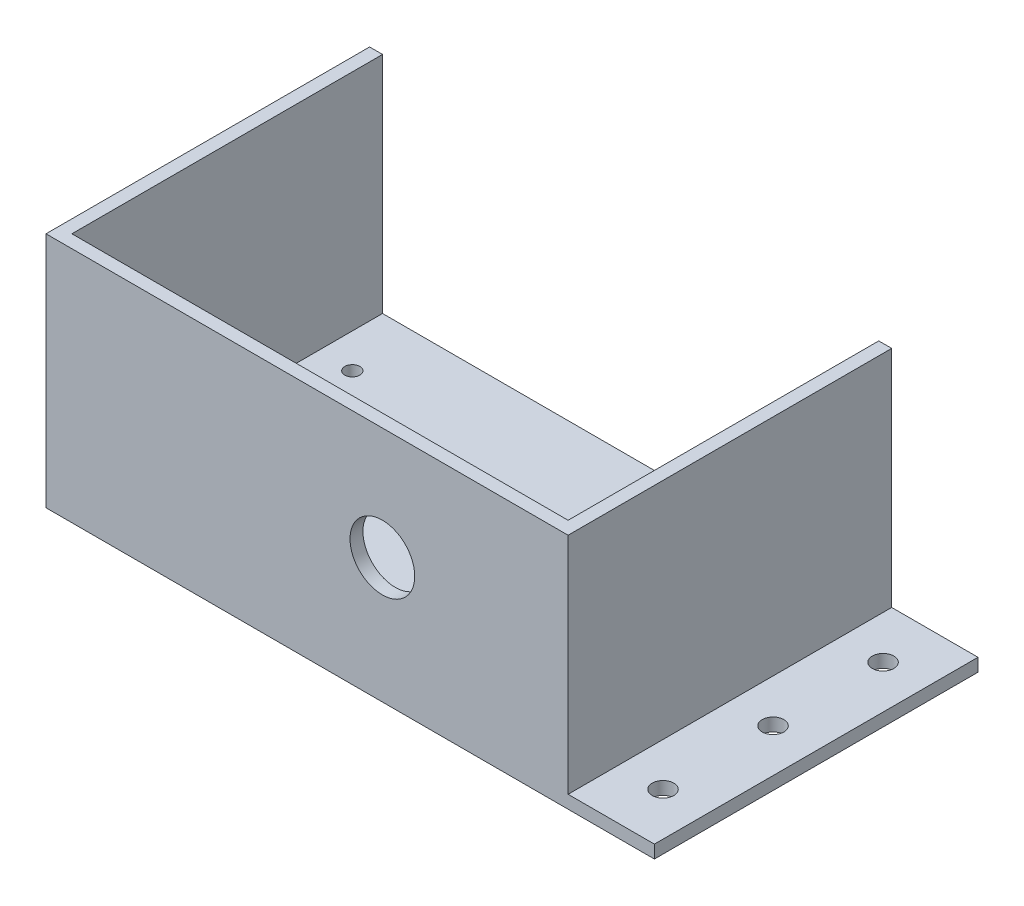
ISO-10303-21;
HEADER;
FILE_DESCRIPTION(('STEP AP214'),'2;1');
FILE_NAME('part.step','',(''),(''),'','','');
FILE_SCHEMA(('AUTOMOTIVE_DESIGN { 1 0 10303 214 1 1 1 1 }'));
ENDSEC;
DATA;
#1=APPLICATION_CONTEXT('core data for automotive mechanical design processes');
#2=APPLICATION_PROTOCOL_DEFINITION('international standard','automotive_design',2000,#1);
#3=PRODUCT_CONTEXT('',#1,'mechanical');
#4=PRODUCT('Part','Part','',(#3));
#5=PRODUCT_RELATED_PRODUCT_CATEGORY('part','',(#4));
#6=PRODUCT_DEFINITION_FORMATION('','',#4);
#7=PRODUCT_DEFINITION_CONTEXT('part definition',#1,'design');
#8=PRODUCT_DEFINITION('design','',#6,#7);
#9=PRODUCT_DEFINITION_SHAPE('','',#8);
#10=(LENGTH_UNIT() NAMED_UNIT(*) SI_UNIT(.MILLI.,.METRE.));
#11=(NAMED_UNIT(*) PLANE_ANGLE_UNIT() SI_UNIT($,.RADIAN.));
#12=(NAMED_UNIT(*) SI_UNIT($,.STERADIAN.) SOLID_ANGLE_UNIT());
#13=UNCERTAINTY_MEASURE_WITH_UNIT(LENGTH_MEASURE(1.E-05),#10,'distance_accuracy_value','');
#14=(GEOMETRIC_REPRESENTATION_CONTEXT(3) GLOBAL_UNCERTAINTY_ASSIGNED_CONTEXT((#13)) GLOBAL_UNIT_ASSIGNED_CONTEXT((#10,
#11,#12)) REPRESENTATION_CONTEXT('',''));
#15=CARTESIAN_POINT('',(0.,0.,0.));
#16=DIRECTION('',(0.,0.,1.));
#17=DIRECTION('',(1.,0.,0.));
#18=AXIS2_PLACEMENT_3D('',#15,#16,#17);
#19=CARTESIAN_POINT('',(121.,58.,0.));
#20=DIRECTION('',(-1.,0.,0.));
#21=DIRECTION('',(0.,0.,1.));
#22=AXIS2_PLACEMENT_3D('',#19,#20,#21);
#23=PLANE('',#22);
#24=DIRECTION('',(0.,-1.,0.));
#25=VECTOR('',#24,1.);
#26=CARTESIAN_POINT('',(121.,58.,-75.));
#27=LINE('',#26,#25);
#28=CARTESIAN_POINT('',(121.,55.,-75.));
#29=VERTEX_POINT('',#28);
#30=CARTESIAN_POINT('',(121.,3.00000000000002,-75.));
#31=VERTEX_POINT('',#30);
#32=EDGE_CURVE('E57',#29,#31,#27,.T.);
#33=ORIENTED_EDGE('',*,*,#32,.F.);
#34=DIRECTION('',(0.,0.,1.));
#35=VECTOR('',#34,1.);
#36=CARTESIAN_POINT('',(121.,55.,-75.));
#37=LINE('',#36,#35);
#38=CARTESIAN_POINT('',(121.,55.,0.));
#39=VERTEX_POINT('',#38);
#40=EDGE_CURVE('E128',#29,#39,#37,.T.);
#41=ORIENTED_EDGE('',*,*,#40,.T.);
#42=DIRECTION('',(0.,-1.,0.));
#43=VECTOR('',#42,1.);
#44=CARTESIAN_POINT('',(121.,58.,0.));
#45=LINE('',#44,#43);
#46=CARTESIAN_POINT('',(121.,3.,0.));
#47=VERTEX_POINT('',#46);
#48=EDGE_CURVE('E135',#39,#47,#45,.T.);
#49=ORIENTED_EDGE('',*,*,#48,.T.);
#50=DIRECTION('',(0.,0.,1.));
#51=VECTOR('',#50,1.);
#52=CARTESIAN_POINT('',(121.,3.,0.));
#53=LINE('',#52,#51);
#54=EDGE_CURVE('E180',#31,#47,#53,.T.);
#55=ORIENTED_EDGE('',*,*,#54,.F.);
#56=EDGE_LOOP('',(#33,#41,#49,#55));
#57=FACE_BOUND('',#56,.T.);
#58=ADVANCED_FACE('F35',(#57),#23,.F.);
#59=CARTESIAN_POINT('',(0.,58.,0.));
#60=DIRECTION('',(1.,0.,0.));
#61=DIRECTION('',(0.,0.,-1.));
#62=AXIS2_PLACEMENT_3D('',#59,#60,#61);
#63=PLANE('',#62);
#64=DIRECTION('',(0.,-1.,0.));
#65=VECTOR('',#64,1.);
#66=CARTESIAN_POINT('',(0.,58.,0.));
#67=LINE('',#66,#65);
#68=CARTESIAN_POINT('',(0.,55.,0.));
#69=VERTEX_POINT('',#68);
#70=CARTESIAN_POINT('',(0.,0.,0.));
#71=VERTEX_POINT('',#70);
#72=EDGE_CURVE('E43',#69,#71,#67,.T.);
#73=ORIENTED_EDGE('',*,*,#72,.F.);
#74=DIRECTION('',(0.,0.,1.));
#75=VECTOR('',#74,1.);
#76=CARTESIAN_POINT('',(0.,55.,-75.));
#77=LINE('',#76,#75);
#78=CARTESIAN_POINT('',(0.,55.,-75.));
#79=VERTEX_POINT('',#78);
#80=EDGE_CURVE('E114',#79,#69,#77,.T.);
#81=ORIENTED_EDGE('',*,*,#80,.F.);
#82=DIRECTION('',(0.,-1.,0.));
#83=VECTOR('',#82,1.);
#84=CARTESIAN_POINT('',(0.,58.,-75.));
#85=LINE('',#84,#83);
#86=CARTESIAN_POINT('',(0.,0.,-75.));
#87=VERTEX_POINT('',#86);
#88=EDGE_CURVE('E126',#79,#87,#85,.T.);
#89=ORIENTED_EDGE('',*,*,#88,.T.);
#90=DIRECTION('',(0.,0.,1.));
#91=VECTOR('',#90,1.);
#92=CARTESIAN_POINT('',(0.,0.,0.));
#93=LINE('',#92,#91);
#94=EDGE_CURVE('E217',#87,#71,#93,.T.);
#95=ORIENTED_EDGE('',*,*,#94,.T.);
#96=EDGE_LOOP('',(#73,#81,#89,#95));
#97=FACE_BOUND('',#96,.T.);
#98=ADVANCED_FACE('F37',(#97),#63,.F.);
#99=CARTESIAN_POINT('',(0.,58.,0.));
#100=DIRECTION('',(0.,0.,-1.));
#101=DIRECTION('',(-1.,0.,0.));
#102=AXIS2_PLACEMENT_3D('',#99,#100,#101);
#103=PLANE('',#102);
#104=CARTESIAN_POINT('',(77.9555837563452,29.,0.));
#105=DIRECTION('',(0.,0.,1.));
#106=DIRECTION('',(1.,0.,0.));
#107=AXIS2_PLACEMENT_3D('',#104,#105,#106);
#108=CIRCLE('',#107,7.50000000000001);
#109=CARTESIAN_POINT('',(85.4555837563452,29.,0.));
#110=VERTEX_POINT('',#109);
#111=EDGE_CURVE('E147',#110,#110,#108,.T.);
#112=ORIENTED_EDGE('',*,*,#111,.F.);
#113=EDGE_LOOP('',(#112));
#114=FACE_BOUND('',#113,.T.);
#115=ORIENTED_EDGE('',*,*,#48,.F.);
#116=DIRECTION('',(1.,0.,0.));
#117=VECTOR('',#116,1.);
#118=CARTESIAN_POINT('',(0.,55.,0.));
#119=LINE('',#118,#117);
#120=EDGE_CURVE('E234',#69,#39,#119,.T.);
#121=ORIENTED_EDGE('',*,*,#120,.F.);
#122=ORIENTED_EDGE('',*,*,#72,.T.);
#123=DIRECTION('',(1.,0.,0.));
#124=VECTOR('',#123,1.);
#125=CARTESIAN_POINT('',(0.,0.,0.));
#126=LINE('',#125,#124);
#127=CARTESIAN_POINT('',(141.,0.,0.));
#128=VERTEX_POINT('',#127);
#129=EDGE_CURVE('E137',#71,#128,#126,.T.);
#130=ORIENTED_EDGE('',*,*,#129,.T.);
#131=DIRECTION('',(0.,-1.,0.));
#132=VECTOR('',#131,1.);
#133=CARTESIAN_POINT('',(141.,0.,0.));
#134=LINE('',#133,#132);
#135=CARTESIAN_POINT('',(141.,3.,0.));
#136=VERTEX_POINT('',#135);
#137=EDGE_CURVE('E181',#136,#128,#134,.T.);
#138=ORIENTED_EDGE('',*,*,#137,.F.);
#139=DIRECTION('',(-1.,0.,0.));
#140=VECTOR('',#139,1.);
#141=CARTESIAN_POINT('',(141.,3.,0.));
#142=LINE('',#141,#140);
#143=EDGE_CURVE('E191',#136,#47,#142,.T.);
#144=ORIENTED_EDGE('',*,*,#143,.T.);
#145=EDGE_LOOP('',(#115,#121,#122,#130,#138,#144));
#146=FACE_BOUND('',#145,.T.);
#147=ADVANCED_FACE('F225',(#114,#146),#103,.F.);
#148=CARTESIAN_POINT('',(0.,58.,-75.));
#149=DIRECTION('',(0.,0.,1.));
#150=DIRECTION('',(1.,0.,0.));
#151=AXIS2_PLACEMENT_3D('',#148,#149,#150);
#152=PLANE('',#151);
#153=ORIENTED_EDGE('',*,*,#88,.F.);
#154=DIRECTION('',(1.,0.,0.));
#155=VECTOR('',#154,1.);
#156=CARTESIAN_POINT('',(0.,55.,-75.));
#157=LINE('',#156,#155);
#158=CARTESIAN_POINT('',(3.,55.,-75.));
#159=VERTEX_POINT('',#158);
#160=EDGE_CURVE('E111',#79,#159,#157,.T.);
#161=ORIENTED_EDGE('',*,*,#160,.T.);
#162=DIRECTION('',(0.,1.,0.));
#163=VECTOR('',#162,1.);
#164=CARTESIAN_POINT('',(3.,3.,-75.));
#165=LINE('',#164,#163);
#166=CARTESIAN_POINT('',(3.,3.,-75.));
#167=VERTEX_POINT('',#166);
#168=EDGE_CURVE('E199',#167,#159,#165,.T.);
#169=ORIENTED_EDGE('',*,*,#168,.F.);
#170=DIRECTION('',(-1.,0.,0.));
#171=VECTOR('',#170,1.);
#172=CARTESIAN_POINT('',(3.,3.,-75.));
#173=LINE('',#172,#171);
#174=CARTESIAN_POINT('',(118.,2.99999999999999,-75.));
#175=VERTEX_POINT('',#174);
#176=EDGE_CURVE('E204',#175,#167,#173,.T.);
#177=ORIENTED_EDGE('',*,*,#176,.F.);
#178=DIRECTION('',(0.,-1.,0.));
#179=VECTOR('',#178,1.);
#180=CARTESIAN_POINT('',(118.,2.99999999999999,-75.));
#181=LINE('',#180,#179);
#182=CARTESIAN_POINT('',(118.,55.,-75.));
#183=VERTEX_POINT('',#182);
#184=EDGE_CURVE('E211',#183,#175,#181,.T.);
#185=ORIENTED_EDGE('',*,*,#184,.F.);
#186=EDGE_CURVE('E121',#183,#29,#157,.T.);
#187=ORIENTED_EDGE('',*,*,#186,.T.);
#188=ORIENTED_EDGE('',*,*,#32,.T.);
#189=DIRECTION('',(-1.,0.,0.));
#190=VECTOR('',#189,1.);
#191=CARTESIAN_POINT('',(141.,3.,-75.));
#192=LINE('',#191,#190);
#193=CARTESIAN_POINT('',(141.,3.,-75.));
#194=VERTEX_POINT('',#193);
#195=EDGE_CURVE('E196',#194,#31,#192,.T.);
#196=ORIENTED_EDGE('',*,*,#195,.F.);
#197=DIRECTION('',(0.,1.,0.));
#198=VECTOR('',#197,1.);
#199=CARTESIAN_POINT('',(141.,0.,-75.));
#200=LINE('',#199,#198);
#201=CARTESIAN_POINT('',(141.,0.,-75.));
#202=VERTEX_POINT('',#201);
#203=EDGE_CURVE('E187',#202,#194,#200,.T.);
#204=ORIENTED_EDGE('',*,*,#203,.F.);
#205=DIRECTION('',(-1.,0.,0.));
#206=VECTOR('',#205,1.);
#207=CARTESIAN_POINT('',(0.,0.,-75.));
#208=LINE('',#207,#206);
#209=EDGE_CURVE('E132',#202,#87,#208,.T.);
#210=ORIENTED_EDGE('',*,*,#209,.T.);
#211=EDGE_LOOP('',(#153,#161,#169,#177,#185,#187,#188,#196,#204,#210));
#212=FACE_BOUND('',#211,.T.);
#213=ADVANCED_FACE('F130',(#212),#152,.F.);
#214=CARTESIAN_POINT('',(0.,0.,0.));
#215=DIRECTION('',(0.,-1.,0.));
#216=DIRECTION('',(0.,0.,-1.));
#217=AXIS2_PLACEMENT_3D('',#214,#215,#216);
#218=PLANE('',#217);
#219=CARTESIAN_POINT('',(11.,0.,-60.));
#220=DIRECTION('',(0.,-1.,0.));
#221=DIRECTION('',(0.,0.,-1.));
#222=AXIS2_PLACEMENT_3D('',#219,#220,#221);
#223=CIRCLE('',#222,1.75);
#224=CARTESIAN_POINT('',(11.,0.,-61.75));
#225=VERTEX_POINT('',#224);
#226=EDGE_CURVE('E151',#225,#225,#223,.T.);
#227=ORIENTED_EDGE('',*,*,#226,.F.);
#228=EDGE_LOOP('',(#227));
#229=FACE_BOUND('',#228,.T.);
#230=CARTESIAN_POINT('',(110.,0.,-60.));
#231=DIRECTION('',(0.,-1.,0.));
#232=DIRECTION('',(0.,0.,-1.));
#233=AXIS2_PLACEMENT_3D('',#230,#231,#232);
#234=CIRCLE('',#233,1.75);
#235=CARTESIAN_POINT('',(110.,0.,-61.75));
#236=VERTEX_POINT('',#235);
#237=EDGE_CURVE('E161',#236,#236,#234,.T.);
#238=ORIENTED_EDGE('',*,*,#237,.F.);
#239=EDGE_LOOP('',(#238));
#240=FACE_BOUND('',#239,.T.);
#241=CARTESIAN_POINT('',(131.,0.,-63.));
#242=DIRECTION('',(0.,-1.,0.));
#243=DIRECTION('',(0.,0.,-1.));
#244=AXIS2_PLACEMENT_3D('',#241,#242,#243);
#245=CIRCLE('',#244,2.5);
#246=CARTESIAN_POINT('',(131.,0.,-65.5));
#247=VERTEX_POINT('',#246);
#248=EDGE_CURVE('E177',#247,#247,#245,.T.);
#249=ORIENTED_EDGE('',*,*,#248,.F.);
#250=EDGE_LOOP('',(#249));
#251=FACE_BOUND('',#250,.T.);
#252=CARTESIAN_POINT('',(131.,0.,-37.5));
#253=DIRECTION('',(0.,-1.,0.));
#254=DIRECTION('',(0.,0.,-1.));
#255=AXIS2_PLACEMENT_3D('',#252,#253,#254);
#256=CIRCLE('',#255,2.5);
#257=CARTESIAN_POINT('',(131.,0.,-40.));
#258=VERTEX_POINT('',#257);
#259=EDGE_CURVE('E174',#258,#258,#256,.T.);
#260=ORIENTED_EDGE('',*,*,#259,.F.);
#261=EDGE_LOOP('',(#260));
#262=FACE_BOUND('',#261,.T.);
#263=CARTESIAN_POINT('',(131.,0.,-12.));
#264=DIRECTION('',(0.,-1.,0.));
#265=DIRECTION('',(0.,0.,-1.));
#266=AXIS2_PLACEMENT_3D('',#263,#264,#265);
#267=CIRCLE('',#266,2.5);
#268=CARTESIAN_POINT('',(131.,0.,-14.5));
#269=VERTEX_POINT('',#268);
#270=EDGE_CURVE('E166',#269,#269,#267,.T.);
#271=ORIENTED_EDGE('',*,*,#270,.F.);
#272=EDGE_LOOP('',(#271));
#273=FACE_BOUND('',#272,.T.);
#274=ORIENTED_EDGE('',*,*,#94,.F.);
#275=ORIENTED_EDGE('',*,*,#209,.F.);
#276=DIRECTION('',(0.,0.,-1.));
#277=VECTOR('',#276,1.);
#278=CARTESIAN_POINT('',(141.,0.,0.));
#279=LINE('',#278,#277);
#280=EDGE_CURVE('E184',#128,#202,#279,.T.);
#281=ORIENTED_EDGE('',*,*,#280,.F.);
#282=ORIENTED_EDGE('',*,*,#129,.F.);
#283=EDGE_LOOP('',(#274,#275,#281,#282));
#284=FACE_BOUND('',#283,.T.);
#285=ADVANCED_FACE('F227',(#229,#240,#251,#262,#273,#284),#218,.T.);
#286=CARTESIAN_POINT('',(3.,3.,-3.));
#287=DIRECTION('',(-1.,0.,0.));
#288=DIRECTION('',(0.,0.,1.));
#289=AXIS2_PLACEMENT_3D('',#286,#287,#288);
#290=PLANE('',#289);
#291=ORIENTED_EDGE('',*,*,#168,.T.);
#292=DIRECTION('',(0.,0.,1.));
#293=VECTOR('',#292,1.);
#294=CARTESIAN_POINT('',(3.,55.,-3.));
#295=LINE('',#294,#293);
#296=CARTESIAN_POINT('',(3.,55.,-3.));
#297=VERTEX_POINT('',#296);
#298=EDGE_CURVE('E117',#159,#297,#295,.T.);
#299=ORIENTED_EDGE('',*,*,#298,.T.);
#300=DIRECTION('',(0.,1.,0.));
#301=VECTOR('',#300,1.);
#302=CARTESIAN_POINT('',(3.,3.,-3.));
#303=LINE('',#302,#301);
#304=CARTESIAN_POINT('',(3.,3.,-3.));
#305=VERTEX_POINT('',#304);
#306=EDGE_CURVE('E200',#305,#297,#303,.T.);
#307=ORIENTED_EDGE('',*,*,#306,.F.);
#308=DIRECTION('',(0.,0.,-1.));
#309=VECTOR('',#308,1.);
#310=CARTESIAN_POINT('',(3.,3.,-3.));
#311=LINE('',#310,#309);
#312=EDGE_CURVE('E215',#305,#167,#311,.T.);
#313=ORIENTED_EDGE('',*,*,#312,.T.);
#314=EDGE_LOOP('',(#291,#299,#307,#313));
#315=FACE_BOUND('',#314,.T.);
#316=ADVANCED_FACE('F252',(#315),#290,.F.);
#317=CARTESIAN_POINT('',(3.,3.,-3.));
#318=DIRECTION('',(0.,-1.,0.));
#319=DIRECTION('',(1.,0.,0.));
#320=AXIS2_PLACEMENT_3D('',#317,#318,#319);
#321=PLANE('',#320);
#322=CARTESIAN_POINT('',(11.,3.,-60.));
#323=DIRECTION('',(0.,-1.,0.));
#324=DIRECTION('',(1.,0.,0.));
#325=AXIS2_PLACEMENT_3D('',#322,#323,#324);
#326=CIRCLE('',#325,1.75);
#327=CARTESIAN_POINT('',(12.75,3.,-60.));
#328=VERTEX_POINT('',#327);
#329=EDGE_CURVE('E150',#328,#328,#326,.T.);
#330=ORIENTED_EDGE('',*,*,#329,.T.);
#331=EDGE_LOOP('',(#330));
#332=FACE_BOUND('',#331,.T.);
#333=CARTESIAN_POINT('',(110.,2.99999999999999,-60.));
#334=DIRECTION('',(0.,-1.,0.));
#335=DIRECTION('',(1.,0.,0.));
#336=AXIS2_PLACEMENT_3D('',#333,#334,#335);
#337=CIRCLE('',#336,1.75);
#338=CARTESIAN_POINT('',(111.75,2.99999999999999,-60.));
#339=VERTEX_POINT('',#338);
#340=EDGE_CURVE('E148',#339,#339,#337,.T.);
#341=ORIENTED_EDGE('',*,*,#340,.T.);
#342=EDGE_LOOP('',(#341));
#343=FACE_BOUND('',#342,.T.);
#344=ORIENTED_EDGE('',*,*,#176,.T.);
#345=ORIENTED_EDGE('',*,*,#312,.F.);
#346=DIRECTION('',(-1.,0.,0.));
#347=VECTOR('',#346,1.);
#348=CARTESIAN_POINT('',(3.,3.,-3.));
#349=LINE('',#348,#347);
#350=CARTESIAN_POINT('',(118.,2.99999999999999,-3.));
#351=VERTEX_POINT('',#350);
#352=EDGE_CURVE('E206',#351,#305,#349,.T.);
#353=ORIENTED_EDGE('',*,*,#352,.F.);
#354=DIRECTION('',(0.,0.,-1.));
#355=VECTOR('',#354,1.);
#356=CARTESIAN_POINT('',(118.,2.99999999999999,-3.));
#357=LINE('',#356,#355);
#358=EDGE_CURVE('E209',#351,#175,#357,.T.);
#359=ORIENTED_EDGE('',*,*,#358,.T.);
#360=EDGE_LOOP('',(#344,#345,#353,#359));
#361=FACE_BOUND('',#360,.T.);
#362=ADVANCED_FACE('F307',(#332,#343,#361),#321,.F.);
#363=CARTESIAN_POINT('',(118.,2.99999999999999,-3.));
#364=DIRECTION('',(1.,0.,0.));
#365=DIRECTION('',(0.,0.,-1.));
#366=AXIS2_PLACEMENT_3D('',#363,#364,#365);
#367=PLANE('',#366);
#368=DIRECTION('',(0.,-1.,0.));
#369=VECTOR('',#368,1.);
#370=CARTESIAN_POINT('',(118.,2.99999999999999,-3.));
#371=LINE('',#370,#369);
#372=CARTESIAN_POINT('',(118.,55.,-3.));
#373=VERTEX_POINT('',#372);
#374=EDGE_CURVE('E203',#373,#351,#371,.T.);
#375=ORIENTED_EDGE('',*,*,#374,.F.);
#376=DIRECTION('',(0.,0.,-1.));
#377=VECTOR('',#376,1.);
#378=CARTESIAN_POINT('',(118.,55.,-3.));
#379=LINE('',#378,#377);
#380=EDGE_CURVE('E49',#373,#183,#379,.T.);
#381=ORIENTED_EDGE('',*,*,#380,.T.);
#382=ORIENTED_EDGE('',*,*,#184,.T.);
#383=ORIENTED_EDGE('',*,*,#358,.F.);
#384=EDGE_LOOP('',(#375,#381,#382,#383));
#385=FACE_BOUND('',#384,.T.);
#386=ADVANCED_FACE('F277',(#385),#367,.F.);
#387=CARTESIAN_POINT('',(0.,0.,-3.));
#388=DIRECTION('',(0.,0.,-1.));
#389=DIRECTION('',(-1.,0.,0.));
#390=AXIS2_PLACEMENT_3D('',#387,#388,#389);
#391=PLANE('',#390);
#392=DIRECTION('',(-1.,0.,0.));
#393=VECTOR('',#392,1.);
#394=CARTESIAN_POINT('',(0.,55.,-3.));
#395=LINE('',#394,#393);
#396=EDGE_CURVE('E11',#373,#297,#395,.T.);
#397=ORIENTED_EDGE('',*,*,#396,.F.);
#398=ORIENTED_EDGE('',*,*,#374,.T.);
#399=ORIENTED_EDGE('',*,*,#352,.T.);
#400=ORIENTED_EDGE('',*,*,#306,.T.);
#401=EDGE_LOOP('',(#397,#398,#399,#400));
#402=FACE_BOUND('',#401,.T.);
#403=CARTESIAN_POINT('',(77.9555837563452,29.,-3.));
#404=DIRECTION('',(0.,0.,-1.));
#405=DIRECTION('',(-1.,0.,0.));
#406=AXIS2_PLACEMENT_3D('',#403,#404,#405);
#407=CIRCLE('',#406,7.50000000000001);
#408=CARTESIAN_POINT('',(70.4555837563452,29.,-3.));
#409=VERTEX_POINT('',#408);
#410=EDGE_CURVE('E143',#409,#409,#407,.T.);
#411=ORIENTED_EDGE('',*,*,#410,.F.);
#412=EDGE_LOOP('',(#411));
#413=FACE_BOUND('',#412,.T.);
#414=ADVANCED_FACE('F269',(#402,#413),#391,.T.);
#415=CARTESIAN_POINT('',(141.,3.,0.));
#416=DIRECTION('',(0.,-1.,0.));
#417=DIRECTION('',(0.,0.,-1.));
#418=AXIS2_PLACEMENT_3D('',#415,#416,#417);
#419=PLANE('',#418);
#420=CARTESIAN_POINT('',(131.,3.,-63.));
#421=DIRECTION('',(0.,1.,0.));
#422=DIRECTION('',(0.,0.,1.));
#423=AXIS2_PLACEMENT_3D('',#420,#421,#422);
#424=CIRCLE('',#423,2.5);
#425=CARTESIAN_POINT('',(131.,3.,-60.5));
#426=VERTEX_POINT('',#425);
#427=EDGE_CURVE('E163',#426,#426,#424,.T.);
#428=ORIENTED_EDGE('',*,*,#427,.F.);
#429=EDGE_LOOP('',(#428));
#430=FACE_BOUND('',#429,.T.);
#431=CARTESIAN_POINT('',(131.,3.,-37.5));
#432=DIRECTION('',(0.,1.,0.));
#433=DIRECTION('',(0.,0.,1.));
#434=AXIS2_PLACEMENT_3D('',#431,#432,#433);
#435=CIRCLE('',#434,2.5);
#436=CARTESIAN_POINT('',(131.,3.,-35.));
#437=VERTEX_POINT('',#436);
#438=EDGE_CURVE('E167',#437,#437,#435,.T.);
#439=ORIENTED_EDGE('',*,*,#438,.F.);
#440=EDGE_LOOP('',(#439));
#441=FACE_BOUND('',#440,.T.);
#442=CARTESIAN_POINT('',(131.,3.,-12.));
#443=DIRECTION('',(0.,1.,0.));
#444=DIRECTION('',(0.,0.,1.));
#445=AXIS2_PLACEMENT_3D('',#442,#443,#444);
#446=CIRCLE('',#445,2.5);
#447=CARTESIAN_POINT('',(131.,3.,-9.50000000000001));
#448=VERTEX_POINT('',#447);
#449=EDGE_CURVE('E146',#448,#448,#446,.T.);
#450=ORIENTED_EDGE('',*,*,#449,.F.);
#451=EDGE_LOOP('',(#450));
#452=FACE_BOUND('',#451,.T.);
#453=ORIENTED_EDGE('',*,*,#54,.T.);
#454=ORIENTED_EDGE('',*,*,#143,.F.);
#455=DIRECTION('',(0.,0.,1.));
#456=VECTOR('',#455,1.);
#457=CARTESIAN_POINT('',(141.,3.,0.));
#458=LINE('',#457,#456);
#459=EDGE_CURVE('E189',#194,#136,#458,.T.);
#460=ORIENTED_EDGE('',*,*,#459,.F.);
#461=ORIENTED_EDGE('',*,*,#195,.T.);
#462=EDGE_LOOP('',(#453,#454,#460,#461));
#463=FACE_BOUND('',#462,.T.);
#464=ADVANCED_FACE('F233',(#430,#441,#452,#463),#419,.F.);
#465=CARTESIAN_POINT('',(141.,0.,0.));
#466=DIRECTION('',(-1.,0.,0.));
#467=DIRECTION('',(0.,0.,1.));
#468=AXIS2_PLACEMENT_3D('',#465,#466,#467);
#469=PLANE('',#468);
#470=ORIENTED_EDGE('',*,*,#137,.T.);
#471=ORIENTED_EDGE('',*,*,#280,.T.);
#472=ORIENTED_EDGE('',*,*,#203,.T.);
#473=ORIENTED_EDGE('',*,*,#459,.T.);
#474=EDGE_LOOP('',(#470,#471,#472,#473));
#475=FACE_BOUND('',#474,.T.);
#476=ADVANCED_FACE('F229',(#475),#469,.F.);
#477=CARTESIAN_POINT('',(131.,-17.,-12.));
#478=DIRECTION('',(0.,1.,0.));
#479=DIRECTION('',(0.,0.,1.));
#480=AXIS2_PLACEMENT_3D('',#477,#478,#479);
#481=CYLINDRICAL_SURFACE('',#480,2.5);
#482=ORIENTED_EDGE('',*,*,#270,.T.);
#483=EDGE_LOOP('',(#482));
#484=FACE_BOUND('',#483,.T.);
#485=ORIENTED_EDGE('',*,*,#449,.T.);
#486=EDGE_LOOP('',(#485));
#487=FACE_BOUND('',#486,.T.);
#488=ADVANCED_FACE('F261',(#484,#487),#481,.F.);
#489=CARTESIAN_POINT('',(131.,-17.,-37.5));
#490=DIRECTION('',(0.,1.,0.));
#491=DIRECTION('',(0.,0.,1.));
#492=AXIS2_PLACEMENT_3D('',#489,#490,#491);
#493=CYLINDRICAL_SURFACE('',#492,2.5);
#494=ORIENTED_EDGE('',*,*,#259,.T.);
#495=EDGE_LOOP('',(#494));
#496=FACE_BOUND('',#495,.T.);
#497=ORIENTED_EDGE('',*,*,#438,.T.);
#498=EDGE_LOOP('',(#497));
#499=FACE_BOUND('',#498,.T.);
#500=ADVANCED_FACE('F264',(#496,#499),#493,.F.);
#501=CARTESIAN_POINT('',(131.,-17.,-63.));
#502=DIRECTION('',(0.,1.,0.));
#503=DIRECTION('',(0.,0.,1.));
#504=AXIS2_PLACEMENT_3D('',#501,#502,#503);
#505=CYLINDRICAL_SURFACE('',#504,2.5);
#506=ORIENTED_EDGE('',*,*,#248,.T.);
#507=EDGE_LOOP('',(#506));
#508=FACE_BOUND('',#507,.T.);
#509=ORIENTED_EDGE('',*,*,#427,.T.);
#510=EDGE_LOOP('',(#509));
#511=FACE_BOUND('',#510,.T.);
#512=ADVANCED_FACE('F355',(#508,#511),#505,.F.);
#513=CARTESIAN_POINT('',(77.9555837563452,29.,-5.));
#514=DIRECTION('',(0.,0.,1.));
#515=DIRECTION('',(1.,0.,0.));
#516=AXIS2_PLACEMENT_3D('',#513,#514,#515);
#517=CYLINDRICAL_SURFACE('',#516,7.50000000000001);
#518=ORIENTED_EDGE('',*,*,#410,.T.);
#519=EDGE_LOOP('',(#518));
#520=FACE_BOUND('',#519,.T.);
#521=ORIENTED_EDGE('',*,*,#111,.T.);
#522=EDGE_LOOP('',(#521));
#523=FACE_BOUND('',#522,.T.);
#524=ADVANCED_FACE('F349',(#520,#523),#517,.F.);
#525=CARTESIAN_POINT('',(110.,5.,-60.));
#526=DIRECTION('',(0.,-1.,0.));
#527=DIRECTION('',(0.,0.,-1.));
#528=AXIS2_PLACEMENT_3D('',#525,#526,#527);
#529=CYLINDRICAL_SURFACE('',#528,1.75);
#530=ORIENTED_EDGE('',*,*,#237,.T.);
#531=EDGE_LOOP('',(#530));
#532=FACE_BOUND('',#531,.T.);
#533=ORIENTED_EDGE('',*,*,#340,.F.);
#534=EDGE_LOOP('',(#533));
#535=FACE_BOUND('',#534,.T.);
#536=ADVANCED_FACE('F247',(#532,#535),#529,.F.);
#537=CARTESIAN_POINT('',(11.,5.,-60.));
#538=DIRECTION('',(0.,-1.,0.));
#539=DIRECTION('',(0.,0.,-1.));
#540=AXIS2_PLACEMENT_3D('',#537,#538,#539);
#541=CYLINDRICAL_SURFACE('',#540,1.75);
#542=ORIENTED_EDGE('',*,*,#226,.T.);
#543=EDGE_LOOP('',(#542));
#544=FACE_BOUND('',#543,.T.);
#545=ORIENTED_EDGE('',*,*,#329,.F.);
#546=EDGE_LOOP('',(#545));
#547=FACE_BOUND('',#546,.T.);
#548=ADVANCED_FACE('F335',(#544,#547),#541,.F.);
#549=CARTESIAN_POINT('',(0.,55.,-75.));
#550=DIRECTION('',(0.,-1.,0.));
#551=DIRECTION('',(0.,0.,-1.));
#552=AXIS2_PLACEMENT_3D('',#549,#550,#551);
#553=PLANE('',#552);
#554=ORIENTED_EDGE('',*,*,#160,.F.);
#555=ORIENTED_EDGE('',*,*,#80,.T.);
#556=ORIENTED_EDGE('',*,*,#120,.T.);
#557=ORIENTED_EDGE('',*,*,#40,.F.);
#558=ORIENTED_EDGE('',*,*,#186,.F.);
#559=ORIENTED_EDGE('',*,*,#380,.F.);
#560=ORIENTED_EDGE('',*,*,#396,.T.);
#561=ORIENTED_EDGE('',*,*,#298,.F.);
#562=EDGE_LOOP('',(#554,#555,#556,#557,#558,#559,#560,#561));
#563=FACE_BOUND('',#562,.T.);
#564=ADVANCED_FACE('F113',(#563),#553,.F.);
#565=CLOSED_SHELL('',(#58,#98,#147,#213,#285,#316,#362,#386,#414,#464,#476,#488,#500,#512,#524,
#536,#548,#564));
#566=MANIFOLD_SOLID_BREP('B2',#565);
#567=ADVANCED_BREP_SHAPE_REPRESENTATION('',(#18,#566),#14);
#568=SHAPE_DEFINITION_REPRESENTATION(#9,#567);
ENDSEC;
END-ISO-10303-21;
